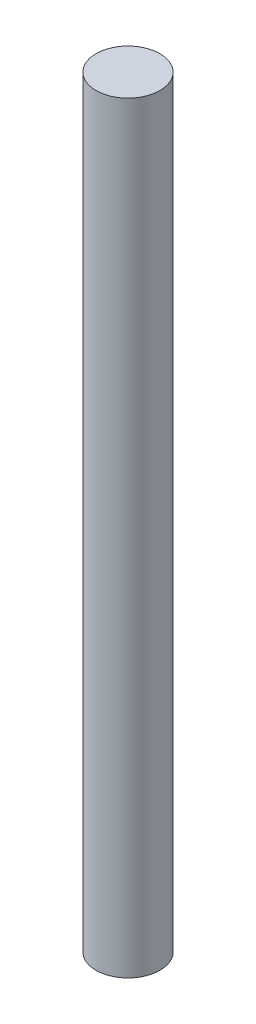
ISO-10303-21;
HEADER;
FILE_DESCRIPTION(('STEP AP214'),'2;1');
FILE_NAME('part.step','',(''),(''),'','','');
FILE_SCHEMA(('AUTOMOTIVE_DESIGN { 1 0 10303 214 1 1 1 1 }'));
ENDSEC;
DATA;
#1=APPLICATION_CONTEXT('core data for automotive mechanical design processes');
#2=APPLICATION_PROTOCOL_DEFINITION('international standard','automotive_design',2000,#1);
#3=PRODUCT_CONTEXT('',#1,'mechanical');
#4=PRODUCT('Part','Part','',(#3));
#5=PRODUCT_RELATED_PRODUCT_CATEGORY('part','',(#4));
#6=PRODUCT_DEFINITION_FORMATION('','',#4);
#7=PRODUCT_DEFINITION_CONTEXT('part definition',#1,'design');
#8=PRODUCT_DEFINITION('design','',#6,#7);
#9=PRODUCT_DEFINITION_SHAPE('','',#8);
#10=(LENGTH_UNIT() NAMED_UNIT(*) SI_UNIT(.MILLI.,.METRE.));
#11=(NAMED_UNIT(*) PLANE_ANGLE_UNIT() SI_UNIT($,.RADIAN.));
#12=(NAMED_UNIT(*) SI_UNIT($,.STERADIAN.) SOLID_ANGLE_UNIT());
#13=UNCERTAINTY_MEASURE_WITH_UNIT(LENGTH_MEASURE(1.E-05),#10,'distance_accuracy_value','');
#14=(GEOMETRIC_REPRESENTATION_CONTEXT(3) GLOBAL_UNCERTAINTY_ASSIGNED_CONTEXT((#13)) GLOBAL_UNIT_ASSIGNED_CONTEXT((#10,
#11,#12)) REPRESENTATION_CONTEXT('',''));
#15=CARTESIAN_POINT('',(0.,0.,0.));
#16=DIRECTION('',(0.,0.,1.));
#17=DIRECTION('',(1.,0.,0.));
#18=AXIS2_PLACEMENT_3D('',#15,#16,#17);
#19=CARTESIAN_POINT('',(0.,40.3,0.));
#20=DIRECTION('',(0.,-1.,0.));
#21=DIRECTION('',(0.,0.,-1.));
#22=AXIS2_PLACEMENT_3D('',#19,#20,#21);
#23=CYLINDRICAL_SURFACE('',#22,5.);
#24=CARTESIAN_POINT('',(0.,0.,0.));
#25=DIRECTION('',(0.,1.,0.));
#26=DIRECTION('',(0.,0.,1.));
#27=AXIS2_PLACEMENT_3D('',#24,#25,#26);
#28=CIRCLE('',#27,5.);
#29=CARTESIAN_POINT('',(0.,0.,5.));
#30=VERTEX_POINT('',#29);
#31=EDGE_CURVE('E10',#30,#30,#28,.T.);
#32=ORIENTED_EDGE('',*,*,#31,.T.);
#33=EDGE_LOOP('',(#32));
#34=FACE_BOUND('',#33,.T.);
#35=CARTESIAN_POINT('',(0.,119.3,0.));
#36=DIRECTION('',(0.,1.,0.));
#37=DIRECTION('',(0.,0.,1.));
#38=AXIS2_PLACEMENT_3D('',#35,#36,#37);
#39=CIRCLE('',#38,5.);
#40=CARTESIAN_POINT('',(0.,119.3,5.));
#41=VERTEX_POINT('',#40);
#42=EDGE_CURVE('E40',#41,#41,#39,.T.);
#43=ORIENTED_EDGE('',*,*,#42,.F.);
#44=EDGE_LOOP('',(#43));
#45=FACE_BOUND('',#44,.T.);
#46=ADVANCED_FACE('F34',(#34,#45),#23,.T.);
#47=CARTESIAN_POINT('',(0.,0.,0.));
#48=DIRECTION('',(0.,1.,0.));
#49=DIRECTION('',(0.,0.,1.));
#50=AXIS2_PLACEMENT_3D('',#47,#48,#49);
#51=PLANE('',#50);
#52=ORIENTED_EDGE('',*,*,#31,.F.);
#53=EDGE_LOOP('',(#52));
#54=FACE_BOUND('',#53,.T.);
#55=ADVANCED_FACE('F49',(#54),#51,.F.);
#56=CARTESIAN_POINT('',(0.,119.3,0.));
#57=DIRECTION('',(0.,1.,0.));
#58=DIRECTION('',(0.,0.,1.));
#59=AXIS2_PLACEMENT_3D('',#56,#57,#58);
#60=PLANE('',#59);
#61=ORIENTED_EDGE('',*,*,#42,.T.);
#62=EDGE_LOOP('',(#61));
#63=FACE_BOUND('',#62,.T.);
#64=ADVANCED_FACE('F46',(#63),#60,.T.);
#65=CLOSED_SHELL('',(#46,#55,#64));
#66=MANIFOLD_SOLID_BREP('B2',#65);
#67=ADVANCED_BREP_SHAPE_REPRESENTATION('',(#18,#66),#14);
#68=SHAPE_DEFINITION_REPRESENTATION(#9,#67);
ENDSEC;
END-ISO-10303-21;
